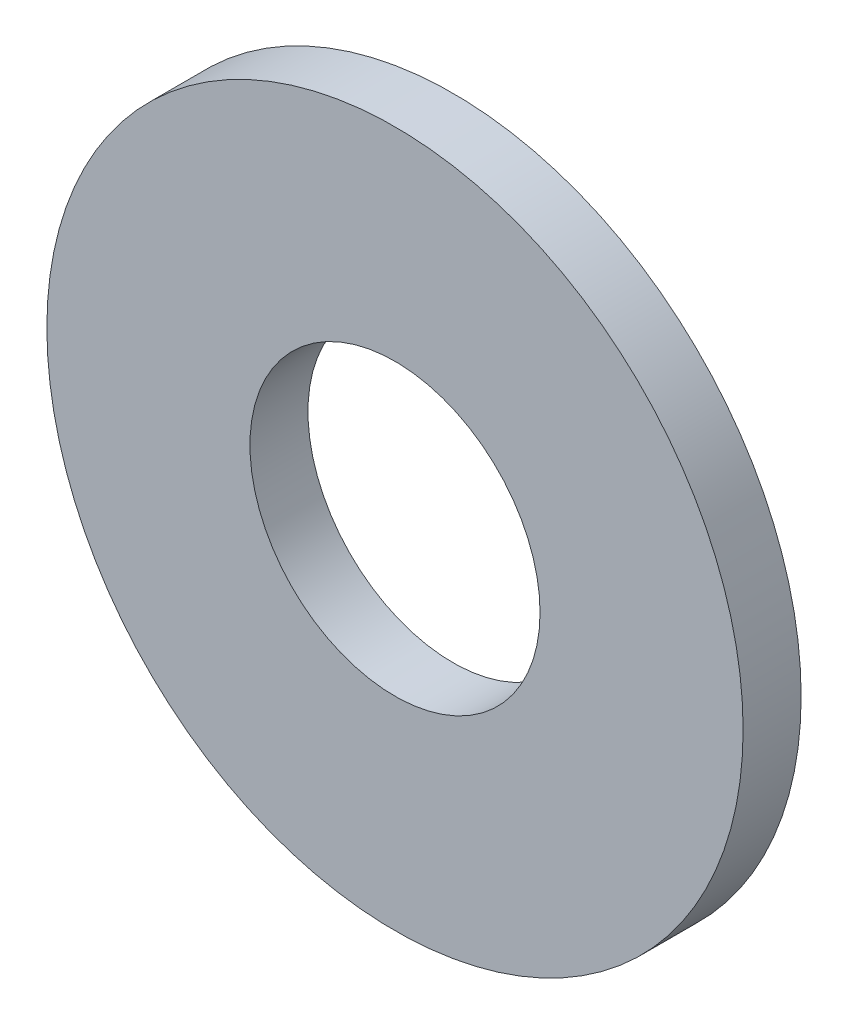
ISO-10303-21;
HEADER;
FILE_DESCRIPTION(('STEP AP214'),'2;1');
FILE_NAME('part.step','',(''),(''),'','','');
FILE_SCHEMA(('AUTOMOTIVE_DESIGN { 1 0 10303 214 1 1 1 1 }'));
ENDSEC;
DATA;
#1=APPLICATION_CONTEXT('core data for automotive mechanical design processes');
#2=APPLICATION_PROTOCOL_DEFINITION('international standard','automotive_design',2000,#1);
#3=PRODUCT_CONTEXT('',#1,'mechanical');
#4=PRODUCT('Part','Part','',(#3));
#5=PRODUCT_RELATED_PRODUCT_CATEGORY('part','',(#4));
#6=PRODUCT_DEFINITION_FORMATION('','',#4);
#7=PRODUCT_DEFINITION_CONTEXT('part definition',#1,'design');
#8=PRODUCT_DEFINITION('design','',#6,#7);
#9=PRODUCT_DEFINITION_SHAPE('','',#8);
#10=(LENGTH_UNIT() NAMED_UNIT(*) SI_UNIT(.MILLI.,.METRE.));
#11=(NAMED_UNIT(*) PLANE_ANGLE_UNIT() SI_UNIT($,.RADIAN.));
#12=(NAMED_UNIT(*) SI_UNIT($,.STERADIAN.) SOLID_ANGLE_UNIT());
#13=UNCERTAINTY_MEASURE_WITH_UNIT(LENGTH_MEASURE(1.E-05),#10,'distance_accuracy_value','');
#14=(GEOMETRIC_REPRESENTATION_CONTEXT(3) GLOBAL_UNCERTAINTY_ASSIGNED_CONTEXT((#13)) GLOBAL_UNIT_ASSIGNED_CONTEXT((#10,
#11,#12)) REPRESENTATION_CONTEXT('',''));
#15=CARTESIAN_POINT('',(0.,0.,0.));
#16=DIRECTION('',(0.,0.,1.));
#17=DIRECTION('',(1.,0.,0.));
#18=AXIS2_PLACEMENT_3D('',#15,#16,#17);
#19=CARTESIAN_POINT('',(0.,0.,1.));
#20=DIRECTION('',(0.,0.,1.));
#21=DIRECTION('',(1.,0.,0.));
#22=AXIS2_PLACEMENT_3D('',#19,#20,#21);
#23=PLANE('',#22);
#24=CARTESIAN_POINT('',(0.,0.,1.));
#25=DIRECTION('',(0.,0.,1.));
#26=DIRECTION('',(1.,0.,0.));
#27=AXIS2_PLACEMENT_3D('',#24,#25,#26);
#28=CIRCLE('',#27,6.);
#29=CARTESIAN_POINT('',(6.,0.,1.));
#30=VERTEX_POINT('',#29);
#31=EDGE_CURVE('E10',#30,#30,#28,.T.);
#32=ORIENTED_EDGE('',*,*,#31,.T.);
#33=EDGE_LOOP('',(#32));
#34=FACE_BOUND('',#33,.T.);
#35=CARTESIAN_POINT('',(0.,0.,1.));
#36=DIRECTION('',(0.,0.,1.));
#37=DIRECTION('',(1.,0.,0.));
#38=AXIS2_PLACEMENT_3D('',#35,#36,#37);
#39=CIRCLE('',#38,2.5);
#40=CARTESIAN_POINT('',(2.5,0.,1.));
#41=VERTEX_POINT('',#40);
#42=EDGE_CURVE('E42',#41,#41,#39,.T.);
#43=ORIENTED_EDGE('',*,*,#42,.F.);
#44=EDGE_LOOP('',(#43));
#45=FACE_BOUND('',#44,.T.);
#46=ADVANCED_FACE('F31',(#34,#45),#23,.T.);
#47=CARTESIAN_POINT('',(0.,0.,0.));
#48=DIRECTION('',(0.,0.,1.));
#49=DIRECTION('',(1.,0.,0.));
#50=AXIS2_PLACEMENT_3D('',#47,#48,#49);
#51=PLANE('',#50);
#52=CARTESIAN_POINT('',(0.,0.,0.));
#53=DIRECTION('',(0.,0.,1.));
#54=DIRECTION('',(1.,0.,0.));
#55=AXIS2_PLACEMENT_3D('',#52,#53,#54);
#56=CIRCLE('',#55,6.);
#57=CARTESIAN_POINT('',(6.,0.,0.));
#58=VERTEX_POINT('',#57);
#59=EDGE_CURVE('E35',#58,#58,#56,.T.);
#60=ORIENTED_EDGE('',*,*,#59,.F.);
#61=EDGE_LOOP('',(#60));
#62=FACE_BOUND('',#61,.T.);
#63=CARTESIAN_POINT('',(0.,0.,0.));
#64=DIRECTION('',(0.,0.,1.));
#65=DIRECTION('',(1.,0.,0.));
#66=AXIS2_PLACEMENT_3D('',#63,#64,#65);
#67=CIRCLE('',#66,2.5);
#68=CARTESIAN_POINT('',(2.5,0.,0.));
#69=VERTEX_POINT('',#68);
#70=EDGE_CURVE('E44',#69,#69,#67,.T.);
#71=ORIENTED_EDGE('',*,*,#70,.T.);
#72=EDGE_LOOP('',(#71));
#73=FACE_BOUND('',#72,.T.);
#74=ADVANCED_FACE('F54',(#62,#73),#51,.F.);
#75=CARTESIAN_POINT('',(0.,0.,1.));
#76=DIRECTION('',(0.,0.,-1.));
#77=DIRECTION('',(-1.,0.,0.));
#78=AXIS2_PLACEMENT_3D('',#75,#76,#77);
#79=CYLINDRICAL_SURFACE('',#78,6.);
#80=ORIENTED_EDGE('',*,*,#31,.F.);
#81=EDGE_LOOP('',(#80));
#82=FACE_BOUND('',#81,.T.);
#83=ORIENTED_EDGE('',*,*,#59,.T.);
#84=EDGE_LOOP('',(#83));
#85=FACE_BOUND('',#84,.T.);
#86=ADVANCED_FACE('F33',(#82,#85),#79,.T.);
#87=CARTESIAN_POINT('',(0.,0.,1.));
#88=DIRECTION('',(0.,0.,-1.));
#89=DIRECTION('',(-1.,0.,0.));
#90=AXIS2_PLACEMENT_3D('',#87,#88,#89);
#91=CYLINDRICAL_SURFACE('',#90,2.5);
#92=ORIENTED_EDGE('',*,*,#42,.T.);
#93=EDGE_LOOP('',(#92));
#94=FACE_BOUND('',#93,.T.);
#95=ORIENTED_EDGE('',*,*,#70,.F.);
#96=EDGE_LOOP('',(#95));
#97=FACE_BOUND('',#96,.T.);
#98=ADVANCED_FACE('F50',(#94,#97),#91,.F.);
#99=CLOSED_SHELL('',(#46,#74,#86,#98));
#100=MANIFOLD_SOLID_BREP('B2',#99);
#101=ADVANCED_BREP_SHAPE_REPRESENTATION('',(#18,#100),#14);
#102=SHAPE_DEFINITION_REPRESENTATION(#9,#101);
ENDSEC;
END-ISO-10303-21;
